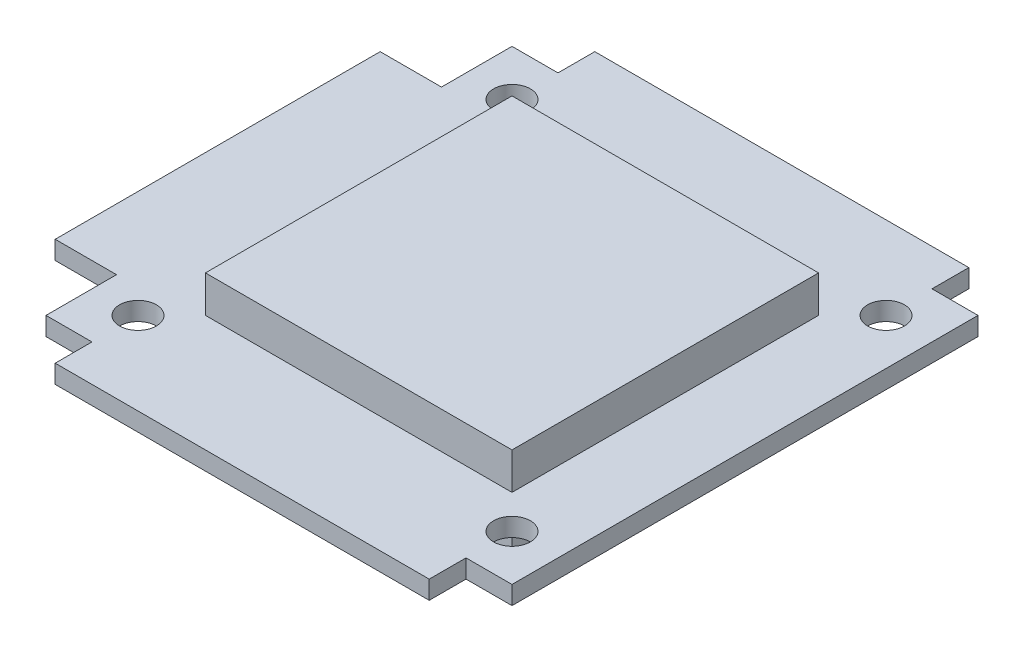
ISO-10303-21;
HEADER;
FILE_DESCRIPTION(('STEP AP214'),'2;1');
FILE_NAME('part.step','',(''),(''),'','','');
FILE_SCHEMA(('AUTOMOTIVE_DESIGN { 1 0 10303 214 1 1 1 1 }'));
ENDSEC;
DATA;
#1=APPLICATION_CONTEXT('core data for automotive mechanical design processes');
#2=APPLICATION_PROTOCOL_DEFINITION('international standard','automotive_design',2000,#1);
#3=PRODUCT_CONTEXT('',#1,'mechanical');
#4=PRODUCT('Part','Part','',(#3));
#5=PRODUCT_RELATED_PRODUCT_CATEGORY('part','',(#4));
#6=PRODUCT_DEFINITION_FORMATION('','',#4);
#7=PRODUCT_DEFINITION_CONTEXT('part definition',#1,'design');
#8=PRODUCT_DEFINITION('design','',#6,#7);
#9=PRODUCT_DEFINITION_SHAPE('','',#8);
#10=(LENGTH_UNIT() NAMED_UNIT(*) SI_UNIT(.MILLI.,.METRE.));
#11=(NAMED_UNIT(*) PLANE_ANGLE_UNIT() SI_UNIT($,.RADIAN.));
#12=(NAMED_UNIT(*) SI_UNIT($,.STERADIAN.) SOLID_ANGLE_UNIT());
#13=UNCERTAINTY_MEASURE_WITH_UNIT(LENGTH_MEASURE(1.E-05),#10,'distance_accuracy_value','');
#14=(GEOMETRIC_REPRESENTATION_CONTEXT(3) GLOBAL_UNCERTAINTY_ASSIGNED_CONTEXT((#13)) GLOBAL_UNIT_ASSIGNED_CONTEXT((#10,
#11,#12)) REPRESENTATION_CONTEXT('',''));
#15=CARTESIAN_POINT('',(0.,0.,0.));
#16=DIRECTION('',(0.,0.,1.));
#17=DIRECTION('',(1.,0.,0.));
#18=AXIS2_PLACEMENT_3D('',#15,#16,#17);
#19=CARTESIAN_POINT('',(-19.,1.5,19.));
#20=DIRECTION('',(0.,0.,-1.));
#21=DIRECTION('',(-1.,0.,0.));
#22=AXIS2_PLACEMENT_3D('',#19,#20,#21);
#23=PLANE('',#22);
#24=DIRECTION('',(0.,-1.,0.));
#25=VECTOR('',#24,1.);
#26=CARTESIAN_POINT('',(-15.25,1.5,19.));
#27=LINE('',#26,#25);
#28=CARTESIAN_POINT('',(-15.25,1.5,19.));
#29=VERTEX_POINT('',#28);
#30=CARTESIAN_POINT('',(-15.25,0.,19.));
#31=VERTEX_POINT('',#30);
#32=EDGE_CURVE('E266',#29,#31,#27,.T.);
#33=ORIENTED_EDGE('',*,*,#32,.F.);
#34=DIRECTION('',(1.,0.,0.));
#35=VECTOR('',#34,1.);
#36=CARTESIAN_POINT('',(-19.,1.5,19.));
#37=LINE('',#36,#35);
#38=CARTESIAN_POINT('',(-19.,1.5,19.));
#39=VERTEX_POINT('',#38);
#40=EDGE_CURVE('E372',#39,#29,#37,.T.);
#41=ORIENTED_EDGE('',*,*,#40,.F.);
#42=DIRECTION('',(0.,-1.,0.));
#43=VECTOR('',#42,1.);
#44=CARTESIAN_POINT('',(-19.,1.5,19.));
#45=LINE('',#44,#43);
#46=CARTESIAN_POINT('',(-19.,0.,19.));
#47=VERTEX_POINT('',#46);
#48=EDGE_CURVE('E391',#39,#47,#45,.T.);
#49=ORIENTED_EDGE('',*,*,#48,.T.);
#50=DIRECTION('',(1.,0.,0.));
#51=VECTOR('',#50,1.);
#52=CARTESIAN_POINT('',(-19.,0.,19.));
#53=LINE('',#52,#51);
#54=EDGE_CURVE('E363',#47,#31,#53,.T.);
#55=ORIENTED_EDGE('',*,*,#54,.T.);
#56=EDGE_LOOP('',(#33,#41,#49,#55));
#57=FACE_BOUND('',#56,.T.);
#58=ADVANCED_FACE('F38',(#57),#23,.F.);
#59=CARTESIAN_POINT('',(-19.,1.5,-19.));
#60=DIRECTION('',(0.,0.,1.));
#61=DIRECTION('',(1.,0.,0.));
#62=AXIS2_PLACEMENT_3D('',#59,#60,#61);
#63=PLANE('',#62);
#64=DIRECTION('',(0.,-1.,0.));
#65=VECTOR('',#64,1.);
#66=CARTESIAN_POINT('',(15.25,1.5,-19.));
#67=LINE('',#66,#65);
#68=CARTESIAN_POINT('',(15.25,1.5,-19.));
#69=VERTEX_POINT('',#68);
#70=CARTESIAN_POINT('',(15.25,0.,-19.));
#71=VERTEX_POINT('',#70);
#72=EDGE_CURVE('E304',#69,#71,#67,.T.);
#73=ORIENTED_EDGE('',*,*,#72,.F.);
#74=DIRECTION('',(-1.,0.,0.));
#75=VECTOR('',#74,1.);
#76=CARTESIAN_POINT('',(-19.,1.5,-19.));
#77=LINE('',#76,#75);
#78=CARTESIAN_POINT('',(19.,1.5,-19.));
#79=VERTEX_POINT('',#78);
#80=EDGE_CURVE('E364',#79,#69,#77,.T.);
#81=ORIENTED_EDGE('',*,*,#80,.F.);
#82=DIRECTION('',(0.,-1.,0.));
#83=VECTOR('',#82,1.);
#84=CARTESIAN_POINT('',(19.,1.5,-19.));
#85=LINE('',#84,#83);
#86=CARTESIAN_POINT('',(19.,0.,-19.));
#87=VERTEX_POINT('',#86);
#88=EDGE_CURVE('E397',#79,#87,#85,.T.);
#89=ORIENTED_EDGE('',*,*,#88,.T.);
#90=DIRECTION('',(-1.,0.,0.));
#91=VECTOR('',#90,1.);
#92=CARTESIAN_POINT('',(-19.,0.,-19.));
#93=LINE('',#92,#91);
#94=EDGE_CURVE('E379',#87,#71,#93,.T.);
#95=ORIENTED_EDGE('',*,*,#94,.T.);
#96=EDGE_LOOP('',(#73,#81,#89,#95));
#97=FACE_BOUND('',#96,.T.);
#98=ADVANCED_FACE('F434',(#97),#63,.F.);
#99=CARTESIAN_POINT('',(-19.,1.5,19.));
#100=DIRECTION('',(1.,0.,0.));
#101=DIRECTION('',(0.,0.,-1.));
#102=AXIS2_PLACEMENT_3D('',#99,#100,#101);
#103=PLANE('',#102);
#104=DIRECTION('',(0.,-1.,0.));
#105=VECTOR('',#104,1.);
#106=CARTESIAN_POINT('',(-19.,1.5,-13.25));
#107=LINE('',#106,#105);
#108=CARTESIAN_POINT('',(-19.,1.5,-13.25));
#109=VERTEX_POINT('',#108);
#110=CARTESIAN_POINT('',(-19.,0.,-13.25));
#111=VERTEX_POINT('',#110);
#112=EDGE_CURVE('E326',#109,#111,#107,.T.);
#113=ORIENTED_EDGE('',*,*,#112,.F.);
#114=DIRECTION('',(0.,0.,1.));
#115=VECTOR('',#114,1.);
#116=CARTESIAN_POINT('',(-19.,1.5,19.));
#117=LINE('',#116,#115);
#118=CARTESIAN_POINT('',(-19.,1.5,-19.));
#119=VERTEX_POINT('',#118);
#120=EDGE_CURVE('E368',#119,#109,#117,.T.);
#121=ORIENTED_EDGE('',*,*,#120,.F.);
#122=DIRECTION('',(0.,-1.,0.));
#123=VECTOR('',#122,1.);
#124=CARTESIAN_POINT('',(-19.,1.5,-19.));
#125=LINE('',#124,#123);
#126=CARTESIAN_POINT('',(-19.,0.,-19.));
#127=VERTEX_POINT('',#126);
#128=EDGE_CURVE('E394',#119,#127,#125,.T.);
#129=ORIENTED_EDGE('',*,*,#128,.T.);
#130=DIRECTION('',(0.,0.,1.));
#131=VECTOR('',#130,1.);
#132=CARTESIAN_POINT('',(-19.,0.,19.));
#133=LINE('',#132,#131);
#134=EDGE_CURVE('E383',#127,#111,#133,.T.);
#135=ORIENTED_EDGE('',*,*,#134,.T.);
#136=EDGE_LOOP('',(#113,#121,#129,#135));
#137=FACE_BOUND('',#136,.T.);
#138=ADVANCED_FACE('F442',(#137),#103,.F.);
#139=CARTESIAN_POINT('',(0.,1.5,0.));
#140=DIRECTION('',(0.,-1.,0.));
#141=DIRECTION('',(0.,0.,-1.));
#142=AXIS2_PLACEMENT_3D('',#139,#140,#141);
#143=PLANE('',#142);
#144=DIRECTION('',(1.,0.,0.));
#145=VECTOR('',#144,1.);
#146=CARTESIAN_POINT('',(0.,1.5,-12.5));
#147=LINE('',#146,#145);
#148=CARTESIAN_POINT('',(-12.5,1.5,-12.5));
#149=VERTEX_POINT('',#148);
#150=CARTESIAN_POINT('',(12.5,1.5,-12.5));
#151=VERTEX_POINT('',#150);
#152=EDGE_CURVE('E238',#149,#151,#147,.T.);
#153=ORIENTED_EDGE('',*,*,#152,.T.);
#154=DIRECTION('',(0.,0.,1.));
#155=VECTOR('',#154,1.);
#156=CARTESIAN_POINT('',(12.5,1.5,0.));
#157=LINE('',#156,#155);
#158=CARTESIAN_POINT('',(12.5,1.5,12.5));
#159=VERTEX_POINT('',#158);
#160=EDGE_CURVE('E201',#151,#159,#157,.T.);
#161=ORIENTED_EDGE('',*,*,#160,.T.);
#162=DIRECTION('',(-1.,0.,0.));
#163=VECTOR('',#162,1.);
#164=CARTESIAN_POINT('',(0.,1.5,12.5));
#165=LINE('',#164,#163);
#166=CARTESIAN_POINT('',(-12.5,1.5,12.5));
#167=VERTEX_POINT('',#166);
#168=EDGE_CURVE('E252',#159,#167,#165,.T.);
#169=ORIENTED_EDGE('',*,*,#168,.T.);
#170=DIRECTION('',(0.,0.,-1.));
#171=VECTOR('',#170,1.);
#172=CARTESIAN_POINT('',(-12.5,1.5,0.));
#173=LINE('',#172,#171);
#174=EDGE_CURVE('E249',#167,#149,#173,.T.);
#175=ORIENTED_EDGE('',*,*,#174,.T.);
#176=EDGE_LOOP('',(#153,#161,#169,#175));
#177=FACE_BOUND('',#176,.T.);
#178=DIRECTION('',(0.,0.,-1.));
#179=VECTOR('',#178,1.);
#180=CARTESIAN_POINT('',(19.,1.5,19.));
#181=LINE('',#180,#179);
#182=CARTESIAN_POINT('',(19.,1.5,19.));
#183=VERTEX_POINT('',#182);
#184=EDGE_CURVE('E359',#183,#79,#181,.T.);
#185=ORIENTED_EDGE('',*,*,#184,.T.);
#186=ORIENTED_EDGE('',*,*,#80,.T.);
#187=DIRECTION('',(0.,0.,1.));
#188=VECTOR('',#187,1.);
#189=CARTESIAN_POINT('',(15.25,1.5,-19.));
#190=LINE('',#189,#188);
#191=CARTESIAN_POINT('',(15.25,1.5,-22.));
#192=VERTEX_POINT('',#191);
#193=EDGE_CURVE('E290',#192,#69,#190,.T.);
#194=ORIENTED_EDGE('',*,*,#193,.F.);
#195=DIRECTION('',(1.,0.,0.));
#196=VECTOR('',#195,1.);
#197=CARTESIAN_POINT('',(-15.25,1.5,-22.));
#198=LINE('',#197,#196);
#199=CARTESIAN_POINT('',(-15.25,1.5,-22.));
#200=VERTEX_POINT('',#199);
#201=EDGE_CURVE('E286',#200,#192,#198,.T.);
#202=ORIENTED_EDGE('',*,*,#201,.F.);
#203=DIRECTION('',(0.,0.,-1.));
#204=VECTOR('',#203,1.);
#205=CARTESIAN_POINT('',(-15.25,1.5,-19.));
#206=LINE('',#205,#204);
#207=CARTESIAN_POINT('',(-15.25,1.5,-19.));
#208=VERTEX_POINT('',#207);
#209=EDGE_CURVE('E283',#208,#200,#206,.T.);
#210=ORIENTED_EDGE('',*,*,#209,.F.);
#211=EDGE_CURVE('E362',#208,#119,#77,.T.);
#212=ORIENTED_EDGE('',*,*,#211,.T.);
#213=ORIENTED_EDGE('',*,*,#120,.T.);
#214=DIRECTION('',(1.,0.,0.));
#215=VECTOR('',#214,1.);
#216=CARTESIAN_POINT('',(-19.,1.5,-13.25));
#217=LINE('',#216,#215);
#218=CARTESIAN_POINT('',(-24.,1.5,-13.25));
#219=VERTEX_POINT('',#218);
#220=EDGE_CURVE('E316',#219,#109,#217,.T.);
#221=ORIENTED_EDGE('',*,*,#220,.F.);
#222=DIRECTION('',(0.,0.,-1.));
#223=VECTOR('',#222,1.);
#224=CARTESIAN_POINT('',(-24.,1.5,13.25));
#225=LINE('',#224,#223);
#226=CARTESIAN_POINT('',(-24.,1.5,13.25));
#227=VERTEX_POINT('',#226);
#228=EDGE_CURVE('E312',#227,#219,#225,.T.);
#229=ORIENTED_EDGE('',*,*,#228,.F.);
#230=DIRECTION('',(-1.,0.,0.));
#231=VECTOR('',#230,1.);
#232=CARTESIAN_POINT('',(-19.,1.5,13.25));
#233=LINE('',#232,#231);
#234=CARTESIAN_POINT('',(-19.,1.5,13.25));
#235=VERTEX_POINT('',#234);
#236=EDGE_CURVE('E309',#235,#227,#233,.T.);
#237=ORIENTED_EDGE('',*,*,#236,.F.);
#238=EDGE_CURVE('E367',#235,#39,#117,.T.);
#239=ORIENTED_EDGE('',*,*,#238,.T.);
#240=ORIENTED_EDGE('',*,*,#40,.T.);
#241=DIRECTION('',(0.,0.,-1.));
#242=VECTOR('',#241,1.);
#243=CARTESIAN_POINT('',(-15.25,1.5,19.));
#244=LINE('',#243,#242);
#245=CARTESIAN_POINT('',(-15.25,1.5,22.));
#246=VERTEX_POINT('',#245);
#247=EDGE_CURVE('E257',#246,#29,#244,.T.);
#248=ORIENTED_EDGE('',*,*,#247,.F.);
#249=DIRECTION('',(-1.,0.,0.));
#250=VECTOR('',#249,1.);
#251=CARTESIAN_POINT('',(-15.25,1.5,22.));
#252=LINE('',#251,#250);
#253=CARTESIAN_POINT('',(15.25,1.5,22.));
#254=VERTEX_POINT('',#253);
#255=EDGE_CURVE('E263',#254,#246,#252,.T.);
#256=ORIENTED_EDGE('',*,*,#255,.F.);
#257=DIRECTION('',(0.,0.,1.));
#258=VECTOR('',#257,1.);
#259=CARTESIAN_POINT('',(15.25,1.5,19.));
#260=LINE('',#259,#258);
#261=CARTESIAN_POINT('',(15.25,1.5,19.));
#262=VERTEX_POINT('',#261);
#263=EDGE_CURVE('E259',#262,#254,#260,.T.);
#264=ORIENTED_EDGE('',*,*,#263,.F.);
#265=EDGE_CURVE('E371',#262,#183,#37,.T.);
#266=ORIENTED_EDGE('',*,*,#265,.T.);
#267=EDGE_LOOP('',(#185,#186,#194,#202,#210,#212,#213,#221,#229,#237,#239,#240,#248,#256,#264,#266));
#268=FACE_BOUND('',#267,.T.);
#269=CARTESIAN_POINT('',(-15.25,1.5,-15.25));
#270=DIRECTION('',(0.,1.,0.));
#271=DIRECTION('',(0.,0.,1.));
#272=AXIS2_PLACEMENT_3D('',#269,#270,#271);
#273=CIRCLE('',#272,1.5);
#274=CARTESIAN_POINT('',(-15.25,1.5,-13.75));
#275=VERTEX_POINT('',#274);
#276=EDGE_CURVE('E353',#275,#275,#273,.T.);
#277=ORIENTED_EDGE('',*,*,#276,.F.);
#278=EDGE_LOOP('',(#277));
#279=FACE_BOUND('',#278,.T.);
#280=CARTESIAN_POINT('',(15.25,1.5,-15.2500000000009));
#281=DIRECTION('',(0.,1.,0.));
#282=DIRECTION('',(0.,0.,1.));
#283=AXIS2_PLACEMENT_3D('',#280,#281,#282);
#284=CIRCLE('',#283,1.50000000000089);
#285=CARTESIAN_POINT('',(15.25,1.5,-13.75));
#286=VERTEX_POINT('',#285);
#287=EDGE_CURVE('E347',#286,#286,#284,.T.);
#288=ORIENTED_EDGE('',*,*,#287,.F.);
#289=EDGE_LOOP('',(#288));
#290=FACE_BOUND('',#289,.T.);
#291=CARTESIAN_POINT('',(15.2500000000009,1.5,15.2499999999991));
#292=DIRECTION('',(0.,1.,0.));
#293=DIRECTION('',(0.,0.,1.));
#294=AXIS2_PLACEMENT_3D('',#291,#292,#293);
#295=CIRCLE('',#294,1.50000000000121);
#296=CARTESIAN_POINT('',(15.2500000000009,1.5,16.7500000000004));
#297=VERTEX_POINT('',#296);
#298=EDGE_CURVE('E341',#297,#297,#295,.T.);
#299=ORIENTED_EDGE('',*,*,#298,.F.);
#300=EDGE_LOOP('',(#299));
#301=FACE_BOUND('',#300,.T.);
#302=CARTESIAN_POINT('',(-15.2499999999991,1.5,15.25));
#303=DIRECTION('',(0.,1.,0.));
#304=DIRECTION('',(0.,0.,1.));
#305=AXIS2_PLACEMENT_3D('',#302,#303,#304);
#306=CIRCLE('',#305,1.50000000000046);
#307=CARTESIAN_POINT('',(-15.2499999999991,1.5,16.7500000000005));
#308=VERTEX_POINT('',#307);
#309=EDGE_CURVE('E335',#308,#308,#306,.T.);
#310=ORIENTED_EDGE('',*,*,#309,.F.);
#311=EDGE_LOOP('',(#310));
#312=FACE_BOUND('',#311,.T.);
#313=ADVANCED_FACE('F467',(#177,#268,#279,#290,#301,#312),#143,.F.);
#314=CARTESIAN_POINT('',(0.,0.,0.));
#315=DIRECTION('',(0.,-1.,0.));
#316=DIRECTION('',(0.,0.,-1.));
#317=AXIS2_PLACEMENT_3D('',#314,#315,#316);
#318=PLANE('',#317);
#319=DIRECTION('',(0.,0.,1.));
#320=VECTOR('',#319,1.);
#321=CARTESIAN_POINT('',(12.5,0.,0.));
#322=LINE('',#321,#320);
#323=CARTESIAN_POINT('',(12.5,0.,-12.5));
#324=VERTEX_POINT('',#323);
#325=CARTESIAN_POINT('',(12.5,0.,12.5));
#326=VERTEX_POINT('',#325);
#327=EDGE_CURVE('E11',#324,#326,#322,.T.);
#328=ORIENTED_EDGE('',*,*,#327,.F.);
#329=DIRECTION('',(1.,0.,0.));
#330=VECTOR('',#329,1.);
#331=CARTESIAN_POINT('',(0.,0.,-12.5));
#332=LINE('',#331,#330);
#333=CARTESIAN_POINT('',(-12.5,0.,-12.5));
#334=VERTEX_POINT('',#333);
#335=EDGE_CURVE('E400',#334,#324,#332,.T.);
#336=ORIENTED_EDGE('',*,*,#335,.F.);
#337=DIRECTION('',(0.,0.,-1.));
#338=VECTOR('',#337,1.);
#339=CARTESIAN_POINT('',(-12.5,0.,0.));
#340=LINE('',#339,#338);
#341=CARTESIAN_POINT('',(-12.5,0.,12.5));
#342=VERTEX_POINT('',#341);
#343=EDGE_CURVE('E403',#342,#334,#340,.T.);
#344=ORIENTED_EDGE('',*,*,#343,.F.);
#345=DIRECTION('',(-1.,0.,0.));
#346=VECTOR('',#345,1.);
#347=CARTESIAN_POINT('',(0.,0.,12.5));
#348=LINE('',#347,#346);
#349=EDGE_CURVE('E46',#326,#342,#348,.T.);
#350=ORIENTED_EDGE('',*,*,#349,.F.);
#351=EDGE_LOOP('',(#328,#336,#344,#350));
#352=FACE_BOUND('',#351,.T.);
#353=CARTESIAN_POINT('',(15.2500000000009,0.,15.2499999999991));
#354=DIRECTION('',(0.,1.,0.));
#355=DIRECTION('',(0.,0.,1.));
#356=AXIS2_PLACEMENT_3D('',#353,#354,#355);
#357=CIRCLE('',#356,1.50000000000121);
#358=CARTESIAN_POINT('',(15.2500000000009,0.,16.7500000000004));
#359=VERTEX_POINT('',#358);
#360=EDGE_CURVE('E338',#359,#359,#357,.T.);
#361=ORIENTED_EDGE('',*,*,#360,.T.);
#362=EDGE_LOOP('',(#361));
#363=FACE_BOUND('',#362,.T.);
#364=CARTESIAN_POINT('',(-15.25,0.,-15.25));
#365=DIRECTION('',(0.,1.,0.));
#366=DIRECTION('',(0.,0.,1.));
#367=AXIS2_PLACEMENT_3D('',#364,#365,#366);
#368=CIRCLE('',#367,1.5);
#369=CARTESIAN_POINT('',(-15.25,0.,-13.75));
#370=VERTEX_POINT('',#369);
#371=EDGE_CURVE('E350',#370,#370,#368,.T.);
#372=ORIENTED_EDGE('',*,*,#371,.T.);
#373=EDGE_LOOP('',(#372));
#374=FACE_BOUND('',#373,.T.);
#375=DIRECTION('',(0.,0.,-1.));
#376=VECTOR('',#375,1.);
#377=CARTESIAN_POINT('',(19.,0.,19.));
#378=LINE('',#377,#376);
#379=CARTESIAN_POINT('',(19.,0.,19.));
#380=VERTEX_POINT('',#379);
#381=EDGE_CURVE('E356',#380,#87,#378,.T.);
#382=ORIENTED_EDGE('',*,*,#381,.F.);
#383=CARTESIAN_POINT('',(15.25,0.,19.));
#384=VERTEX_POINT('',#383);
#385=EDGE_CURVE('E386',#384,#380,#53,.T.);
#386=ORIENTED_EDGE('',*,*,#385,.F.);
#387=DIRECTION('',(0.,0.,1.));
#388=VECTOR('',#387,1.);
#389=CARTESIAN_POINT('',(15.25,0.,19.));
#390=LINE('',#389,#388);
#391=CARTESIAN_POINT('',(15.25,0.,22.));
#392=VERTEX_POINT('',#391);
#393=EDGE_CURVE('E269',#384,#392,#390,.T.);
#394=ORIENTED_EDGE('',*,*,#393,.T.);
#395=DIRECTION('',(-1.,0.,0.));
#396=VECTOR('',#395,1.);
#397=CARTESIAN_POINT('',(-15.25,0.,22.));
#398=LINE('',#397,#396);
#399=CARTESIAN_POINT('',(-15.25,0.,22.));
#400=VERTEX_POINT('',#399);
#401=EDGE_CURVE('E260',#392,#400,#398,.T.);
#402=ORIENTED_EDGE('',*,*,#401,.T.);
#403=DIRECTION('',(0.,0.,-1.));
#404=VECTOR('',#403,1.);
#405=CARTESIAN_POINT('',(-15.25,0.,19.));
#406=LINE('',#405,#404);
#407=EDGE_CURVE('E256',#400,#31,#406,.T.);
#408=ORIENTED_EDGE('',*,*,#407,.T.);
#409=ORIENTED_EDGE('',*,*,#54,.F.);
#410=CARTESIAN_POINT('',(-19.,0.,13.25));
#411=VERTEX_POINT('',#410);
#412=EDGE_CURVE('E382',#411,#47,#133,.T.);
#413=ORIENTED_EDGE('',*,*,#412,.F.);
#414=DIRECTION('',(-1.,0.,0.));
#415=VECTOR('',#414,1.);
#416=CARTESIAN_POINT('',(-19.,0.,13.25));
#417=LINE('',#416,#415);
#418=CARTESIAN_POINT('',(-24.,0.,13.25));
#419=VERTEX_POINT('',#418);
#420=EDGE_CURVE('E303',#411,#419,#417,.T.);
#421=ORIENTED_EDGE('',*,*,#420,.T.);
#422=DIRECTION('',(0.,0.,-1.));
#423=VECTOR('',#422,1.);
#424=CARTESIAN_POINT('',(-24.,0.,13.25));
#425=LINE('',#424,#423);
#426=CARTESIAN_POINT('',(-24.,0.,-13.25));
#427=VERTEX_POINT('',#426);
#428=EDGE_CURVE('E321',#419,#427,#425,.T.);
#429=ORIENTED_EDGE('',*,*,#428,.T.);
#430=DIRECTION('',(1.,0.,0.));
#431=VECTOR('',#430,1.);
#432=CARTESIAN_POINT('',(-19.,0.,-13.25));
#433=LINE('',#432,#431);
#434=EDGE_CURVE('E313',#427,#111,#433,.T.);
#435=ORIENTED_EDGE('',*,*,#434,.T.);
#436=ORIENTED_EDGE('',*,*,#134,.F.);
#437=CARTESIAN_POINT('',(-15.25,0.,-19.));
#438=VERTEX_POINT('',#437);
#439=EDGE_CURVE('E378',#438,#127,#93,.T.);
#440=ORIENTED_EDGE('',*,*,#439,.F.);
#441=DIRECTION('',(0.,0.,-1.));
#442=VECTOR('',#441,1.);
#443=CARTESIAN_POINT('',(-15.25,0.,-19.));
#444=LINE('',#443,#442);
#445=CARTESIAN_POINT('',(-15.25,0.,-22.));
#446=VERTEX_POINT('',#445);
#447=EDGE_CURVE('E276',#438,#446,#444,.T.);
#448=ORIENTED_EDGE('',*,*,#447,.T.);
#449=DIRECTION('',(1.,0.,0.));
#450=VECTOR('',#449,1.);
#451=CARTESIAN_POINT('',(-15.25,0.,-22.));
#452=LINE('',#451,#450);
#453=CARTESIAN_POINT('',(15.25,0.,-22.));
#454=VERTEX_POINT('',#453);
#455=EDGE_CURVE('E295',#446,#454,#452,.T.);
#456=ORIENTED_EDGE('',*,*,#455,.T.);
#457=DIRECTION('',(0.,0.,1.));
#458=VECTOR('',#457,1.);
#459=CARTESIAN_POINT('',(15.25,0.,-19.));
#460=LINE('',#459,#458);
#461=EDGE_CURVE('E287',#454,#71,#460,.T.);
#462=ORIENTED_EDGE('',*,*,#461,.T.);
#463=ORIENTED_EDGE('',*,*,#94,.F.);
#464=EDGE_LOOP('',(#382,#386,#394,#402,#408,#409,#413,#421,#429,#435,#436,#440,#448,#456,#462,#463));
#465=FACE_BOUND('',#464,.T.);
#466=CARTESIAN_POINT('',(15.25,0.,-15.2500000000009));
#467=DIRECTION('',(0.,1.,0.));
#468=DIRECTION('',(0.,0.,1.));
#469=AXIS2_PLACEMENT_3D('',#466,#467,#468);
#470=CIRCLE('',#469,1.50000000000089);
#471=CARTESIAN_POINT('',(15.25,0.,-13.75));
#472=VERTEX_POINT('',#471);
#473=EDGE_CURVE('E344',#472,#472,#470,.T.);
#474=ORIENTED_EDGE('',*,*,#473,.T.);
#475=EDGE_LOOP('',(#474));
#476=FACE_BOUND('',#475,.T.);
#477=CARTESIAN_POINT('',(-15.2499999999991,0.,15.25));
#478=DIRECTION('',(0.,1.,0.));
#479=DIRECTION('',(0.,0.,1.));
#480=AXIS2_PLACEMENT_3D('',#477,#478,#479);
#481=CIRCLE('',#480,1.50000000000046);
#482=CARTESIAN_POINT('',(-15.2499999999991,0.,16.7500000000005));
#483=VERTEX_POINT('',#482);
#484=EDGE_CURVE('E328',#483,#483,#481,.T.);
#485=ORIENTED_EDGE('',*,*,#484,.T.);
#486=EDGE_LOOP('',(#485));
#487=FACE_BOUND('',#486,.T.);
#488=ADVANCED_FACE('F417',(#352,#363,#374,#465,#476,#487),#318,.T.);
#489=CARTESIAN_POINT('',(19.,1.5,19.));
#490=DIRECTION('',(-1.,0.,0.));
#491=DIRECTION('',(0.,0.,1.));
#492=AXIS2_PLACEMENT_3D('',#489,#490,#491);
#493=PLANE('',#492);
#494=ORIENTED_EDGE('',*,*,#381,.T.);
#495=ORIENTED_EDGE('',*,*,#88,.F.);
#496=ORIENTED_EDGE('',*,*,#184,.F.);
#497=DIRECTION('',(0.,-1.,0.));
#498=VECTOR('',#497,1.);
#499=CARTESIAN_POINT('',(19.,1.5,19.));
#500=LINE('',#499,#498);
#501=EDGE_CURVE('E375',#183,#380,#500,.T.);
#502=ORIENTED_EDGE('',*,*,#501,.T.);
#503=EDGE_LOOP('',(#494,#495,#496,#502));
#504=FACE_BOUND('',#503,.T.);
#505=ADVANCED_FACE('F40',(#504),#493,.F.);
#506=ORIENTED_EDGE('',*,*,#211,.F.);
#507=DIRECTION('',(0.,-1.,0.));
#508=VECTOR('',#507,1.);
#509=CARTESIAN_POINT('',(-15.25,1.5,-19.));
#510=LINE('',#509,#508);
#511=EDGE_CURVE('E300',#208,#438,#510,.T.);
#512=ORIENTED_EDGE('',*,*,#511,.T.);
#513=ORIENTED_EDGE('',*,*,#439,.T.);
#514=ORIENTED_EDGE('',*,*,#128,.F.);
#515=EDGE_LOOP('',(#506,#512,#513,#514));
#516=FACE_BOUND('',#515,.T.);
#517=ADVANCED_FACE('F444',(#516),#63,.F.);
#518=ORIENTED_EDGE('',*,*,#238,.F.);
#519=DIRECTION('',(0.,-1.,0.));
#520=VECTOR('',#519,1.);
#521=CARTESIAN_POINT('',(-19.,1.5,13.25));
#522=LINE('',#521,#520);
#523=EDGE_CURVE('E318',#235,#411,#522,.T.);
#524=ORIENTED_EDGE('',*,*,#523,.T.);
#525=ORIENTED_EDGE('',*,*,#412,.T.);
#526=ORIENTED_EDGE('',*,*,#48,.F.);
#527=EDGE_LOOP('',(#518,#524,#525,#526));
#528=FACE_BOUND('',#527,.T.);
#529=ADVANCED_FACE('F450',(#528),#103,.F.);
#530=ORIENTED_EDGE('',*,*,#265,.F.);
#531=DIRECTION('',(0.,-1.,0.));
#532=VECTOR('',#531,1.);
#533=CARTESIAN_POINT('',(15.25,1.5,19.));
#534=LINE('',#533,#532);
#535=EDGE_CURVE('E279',#262,#384,#534,.T.);
#536=ORIENTED_EDGE('',*,*,#535,.T.);
#537=ORIENTED_EDGE('',*,*,#385,.T.);
#538=ORIENTED_EDGE('',*,*,#501,.F.);
#539=EDGE_LOOP('',(#530,#536,#537,#538));
#540=FACE_BOUND('',#539,.T.);
#541=ADVANCED_FACE('F437',(#540),#23,.F.);
#542=CARTESIAN_POINT('',(-15.25,1.5,-15.25));
#543=DIRECTION('',(0.,-1.,0.));
#544=DIRECTION('',(0.,0.,-1.));
#545=AXIS2_PLACEMENT_3D('',#542,#543,#544);
#546=CYLINDRICAL_SURFACE('',#545,1.5);
#547=ORIENTED_EDGE('',*,*,#276,.T.);
#548=EDGE_LOOP('',(#547));
#549=FACE_BOUND('',#548,.T.);
#550=ORIENTED_EDGE('',*,*,#371,.F.);
#551=EDGE_LOOP('',(#550));
#552=FACE_BOUND('',#551,.T.);
#553=ADVANCED_FACE('F449',(#549,#552),#546,.F.);
#554=CARTESIAN_POINT('',(15.25,1.5,-15.2500000000009));
#555=DIRECTION('',(0.,-1.,0.));
#556=DIRECTION('',(0.,0.,-1.));
#557=AXIS2_PLACEMENT_3D('',#554,#555,#556);
#558=CYLINDRICAL_SURFACE('',#557,1.50000000000089);
#559=ORIENTED_EDGE('',*,*,#287,.T.);
#560=EDGE_LOOP('',(#559));
#561=FACE_BOUND('',#560,.T.);
#562=ORIENTED_EDGE('',*,*,#473,.F.);
#563=EDGE_LOOP('',(#562));
#564=FACE_BOUND('',#563,.T.);
#565=ADVANCED_FACE('F457',(#561,#564),#558,.F.);
#566=CARTESIAN_POINT('',(15.2500000000009,1.5,15.2499999999991));
#567=DIRECTION('',(0.,-1.,0.));
#568=DIRECTION('',(0.,0.,-1.));
#569=AXIS2_PLACEMENT_3D('',#566,#567,#568);
#570=CYLINDRICAL_SURFACE('',#569,1.50000000000121);
#571=ORIENTED_EDGE('',*,*,#298,.T.);
#572=EDGE_LOOP('',(#571));
#573=FACE_BOUND('',#572,.T.);
#574=ORIENTED_EDGE('',*,*,#360,.F.);
#575=EDGE_LOOP('',(#574));
#576=FACE_BOUND('',#575,.T.);
#577=ADVANCED_FACE('F534',(#573,#576),#570,.F.);
#578=CARTESIAN_POINT('',(-15.2499999999991,1.5,15.25));
#579=DIRECTION('',(0.,-1.,0.));
#580=DIRECTION('',(0.,0.,-1.));
#581=AXIS2_PLACEMENT_3D('',#578,#579,#580);
#582=CYLINDRICAL_SURFACE('',#581,1.50000000000046);
#583=ORIENTED_EDGE('',*,*,#309,.T.);
#584=EDGE_LOOP('',(#583));
#585=FACE_BOUND('',#584,.T.);
#586=ORIENTED_EDGE('',*,*,#484,.F.);
#587=EDGE_LOOP('',(#586));
#588=FACE_BOUND('',#587,.T.);
#589=ADVANCED_FACE('F538',(#585,#588),#582,.F.);
#590=CARTESIAN_POINT('',(-19.,1.5,-13.25));
#591=DIRECTION('',(0.,0.,-1.));
#592=DIRECTION('',(-1.,0.,0.));
#593=AXIS2_PLACEMENT_3D('',#590,#591,#592);
#594=PLANE('',#593);
#595=ORIENTED_EDGE('',*,*,#434,.F.);
#596=DIRECTION('',(0.,-1.,0.));
#597=VECTOR('',#596,1.);
#598=CARTESIAN_POINT('',(-24.,1.5,-13.25));
#599=LINE('',#598,#597);
#600=EDGE_CURVE('E329',#219,#427,#599,.T.);
#601=ORIENTED_EDGE('',*,*,#600,.F.);
#602=ORIENTED_EDGE('',*,*,#220,.T.);
#603=ORIENTED_EDGE('',*,*,#112,.T.);
#604=EDGE_LOOP('',(#595,#601,#602,#603));
#605=FACE_BOUND('',#604,.T.);
#606=ADVANCED_FACE('F497',(#605),#594,.T.);
#607=CARTESIAN_POINT('',(-24.,1.5,13.25));
#608=DIRECTION('',(-1.,0.,0.));
#609=DIRECTION('',(0.,0.,1.));
#610=AXIS2_PLACEMENT_3D('',#607,#608,#609);
#611=PLANE('',#610);
#612=ORIENTED_EDGE('',*,*,#428,.F.);
#613=DIRECTION('',(0.,-1.,0.));
#614=VECTOR('',#613,1.);
#615=CARTESIAN_POINT('',(-24.,1.5,13.25));
#616=LINE('',#615,#614);
#617=EDGE_CURVE('E331',#227,#419,#616,.T.);
#618=ORIENTED_EDGE('',*,*,#617,.F.);
#619=ORIENTED_EDGE('',*,*,#228,.T.);
#620=ORIENTED_EDGE('',*,*,#600,.T.);
#621=EDGE_LOOP('',(#612,#618,#619,#620));
#622=FACE_BOUND('',#621,.T.);
#623=ADVANCED_FACE('F494',(#622),#611,.T.);
#624=CARTESIAN_POINT('',(-19.,1.5,13.25));
#625=DIRECTION('',(0.,0.,1.));
#626=DIRECTION('',(1.,0.,0.));
#627=AXIS2_PLACEMENT_3D('',#624,#625,#626);
#628=PLANE('',#627);
#629=ORIENTED_EDGE('',*,*,#420,.F.);
#630=ORIENTED_EDGE('',*,*,#523,.F.);
#631=ORIENTED_EDGE('',*,*,#236,.T.);
#632=ORIENTED_EDGE('',*,*,#617,.T.);
#633=EDGE_LOOP('',(#629,#630,#631,#632));
#634=FACE_BOUND('',#633,.T.);
#635=ADVANCED_FACE('F490',(#634),#628,.T.);
#636=CARTESIAN_POINT('',(-15.25,1.5,-19.));
#637=DIRECTION('',(-1.,0.,0.));
#638=DIRECTION('',(0.,0.,1.));
#639=AXIS2_PLACEMENT_3D('',#636,#637,#638);
#640=PLANE('',#639);
#641=ORIENTED_EDGE('',*,*,#447,.F.);
#642=ORIENTED_EDGE('',*,*,#511,.F.);
#643=ORIENTED_EDGE('',*,*,#209,.T.);
#644=DIRECTION('',(0.,-1.,0.));
#645=VECTOR('',#644,1.);
#646=CARTESIAN_POINT('',(-15.25,1.5,-22.));
#647=LINE('',#646,#645);
#648=EDGE_CURVE('E292',#200,#446,#647,.T.);
#649=ORIENTED_EDGE('',*,*,#648,.T.);
#650=EDGE_LOOP('',(#641,#642,#643,#649));
#651=FACE_BOUND('',#650,.T.);
#652=ADVANCED_FACE('F508',(#651),#640,.T.);
#653=CARTESIAN_POINT('',(15.25,1.5,-19.));
#654=DIRECTION('',(1.,0.,0.));
#655=DIRECTION('',(0.,0.,-1.));
#656=AXIS2_PLACEMENT_3D('',#653,#654,#655);
#657=PLANE('',#656);
#658=ORIENTED_EDGE('',*,*,#461,.F.);
#659=DIRECTION('',(0.,-1.,0.));
#660=VECTOR('',#659,1.);
#661=CARTESIAN_POINT('',(15.25,1.5,-22.));
#662=LINE('',#661,#660);
#663=EDGE_CURVE('E306',#192,#454,#662,.T.);
#664=ORIENTED_EDGE('',*,*,#663,.F.);
#665=ORIENTED_EDGE('',*,*,#193,.T.);
#666=ORIENTED_EDGE('',*,*,#72,.T.);
#667=EDGE_LOOP('',(#658,#664,#665,#666));
#668=FACE_BOUND('',#667,.T.);
#669=ADVANCED_FACE('F516',(#668),#657,.T.);
#670=CARTESIAN_POINT('',(-15.25,1.5,-22.));
#671=DIRECTION('',(0.,0.,-1.));
#672=DIRECTION('',(-1.,0.,0.));
#673=AXIS2_PLACEMENT_3D('',#670,#671,#672);
#674=PLANE('',#673);
#675=ORIENTED_EDGE('',*,*,#455,.F.);
#676=ORIENTED_EDGE('',*,*,#648,.F.);
#677=ORIENTED_EDGE('',*,*,#201,.T.);
#678=ORIENTED_EDGE('',*,*,#663,.T.);
#679=EDGE_LOOP('',(#675,#676,#677,#678));
#680=FACE_BOUND('',#679,.T.);
#681=ADVANCED_FACE('F512',(#680),#674,.T.);
#682=CARTESIAN_POINT('',(-15.25,1.5,19.));
#683=DIRECTION('',(-1.,0.,0.));
#684=DIRECTION('',(0.,0.,1.));
#685=AXIS2_PLACEMENT_3D('',#682,#683,#684);
#686=PLANE('',#685);
#687=ORIENTED_EDGE('',*,*,#407,.F.);
#688=DIRECTION('',(0.,-1.,0.));
#689=VECTOR('',#688,1.);
#690=CARTESIAN_POINT('',(-15.25,1.5,22.));
#691=LINE('',#690,#689);
#692=EDGE_CURVE('E274',#246,#400,#691,.T.);
#693=ORIENTED_EDGE('',*,*,#692,.F.);
#694=ORIENTED_EDGE('',*,*,#247,.T.);
#695=ORIENTED_EDGE('',*,*,#32,.T.);
#696=EDGE_LOOP('',(#687,#693,#694,#695));
#697=FACE_BOUND('',#696,.T.);
#698=ADVANCED_FACE('F481',(#697),#686,.T.);
#699=CARTESIAN_POINT('',(-15.25,1.5,22.));
#700=DIRECTION('',(0.,0.,1.));
#701=DIRECTION('',(1.,0.,0.));
#702=AXIS2_PLACEMENT_3D('',#699,#700,#701);
#703=PLANE('',#702);
#704=ORIENTED_EDGE('',*,*,#401,.F.);
#705=DIRECTION('',(0.,-1.,0.));
#706=VECTOR('',#705,1.);
#707=CARTESIAN_POINT('',(15.25,1.5,22.));
#708=LINE('',#707,#706);
#709=EDGE_CURVE('E277',#254,#392,#708,.T.);
#710=ORIENTED_EDGE('',*,*,#709,.F.);
#711=ORIENTED_EDGE('',*,*,#255,.T.);
#712=ORIENTED_EDGE('',*,*,#692,.T.);
#713=EDGE_LOOP('',(#704,#710,#711,#712));
#714=FACE_BOUND('',#713,.T.);
#715=ADVANCED_FACE('F478',(#714),#703,.T.);
#716=CARTESIAN_POINT('',(15.25,1.5,19.));
#717=DIRECTION('',(1.,0.,0.));
#718=DIRECTION('',(0.,0.,-1.));
#719=AXIS2_PLACEMENT_3D('',#716,#717,#718);
#720=PLANE('',#719);
#721=ORIENTED_EDGE('',*,*,#393,.F.);
#722=ORIENTED_EDGE('',*,*,#535,.F.);
#723=ORIENTED_EDGE('',*,*,#263,.T.);
#724=ORIENTED_EDGE('',*,*,#709,.T.);
#725=EDGE_LOOP('',(#721,#722,#723,#724));
#726=FACE_BOUND('',#725,.T.);
#727=ADVANCED_FACE('F429',(#726),#720,.T.);
#728=CARTESIAN_POINT('',(0.,-3.,0.));
#729=DIRECTION('',(0.,-1.,0.));
#730=DIRECTION('',(0.,0.,-1.));
#731=AXIS2_PLACEMENT_3D('',#728,#729,#730);
#732=PLANE('',#731);
#733=DIRECTION('',(0.,0.,-1.));
#734=VECTOR('',#733,1.);
#735=CARTESIAN_POINT('',(12.5,-3.,12.5));
#736=LINE('',#735,#734);
#737=CARTESIAN_POINT('',(12.5,-3.,12.5));
#738=VERTEX_POINT('',#737);
#739=CARTESIAN_POINT('',(12.5,-3.,-12.5));
#740=VERTEX_POINT('',#739);
#741=EDGE_CURVE('E224',#738,#740,#736,.T.);
#742=ORIENTED_EDGE('',*,*,#741,.F.);
#743=DIRECTION('',(1.,0.,0.));
#744=VECTOR('',#743,1.);
#745=CARTESIAN_POINT('',(-12.5,-3.,12.5));
#746=LINE('',#745,#744);
#747=CARTESIAN_POINT('',(-12.5,-3.,12.5));
#748=VERTEX_POINT('',#747);
#749=EDGE_CURVE('E204',#748,#738,#746,.T.);
#750=ORIENTED_EDGE('',*,*,#749,.F.);
#751=DIRECTION('',(0.,0.,1.));
#752=VECTOR('',#751,1.);
#753=CARTESIAN_POINT('',(-12.5,-3.,12.5));
#754=LINE('',#753,#752);
#755=CARTESIAN_POINT('',(-12.5,-3.,-12.5));
#756=VERTEX_POINT('',#755);
#757=EDGE_CURVE('E230',#756,#748,#754,.T.);
#758=ORIENTED_EDGE('',*,*,#757,.F.);
#759=DIRECTION('',(-1.,0.,0.));
#760=VECTOR('',#759,1.);
#761=CARTESIAN_POINT('',(-12.5,-3.,-12.5));
#762=LINE('',#761,#760);
#763=EDGE_CURVE('E227',#740,#756,#762,.T.);
#764=ORIENTED_EDGE('',*,*,#763,.F.);
#765=EDGE_LOOP('',(#742,#750,#758,#764));
#766=FACE_BOUND('',#765,.T.);
#767=ADVANCED_FACE('F414',(#766),#732,.T.);
#768=CARTESIAN_POINT('',(-12.5,-3.,-12.5));
#769=DIRECTION('',(0.,0.,-1.));
#770=DIRECTION('',(-1.,0.,0.));
#771=AXIS2_PLACEMENT_3D('',#768,#769,#770);
#772=PLANE('',#771);
#773=DIRECTION('',(0.,1.,0.));
#774=VECTOR('',#773,1.);
#775=CARTESIAN_POINT('',(-12.5,-3.,-12.5));
#776=LINE('',#775,#774);
#777=EDGE_CURVE('E244',#756,#334,#776,.T.);
#778=ORIENTED_EDGE('',*,*,#777,.T.);
#779=ORIENTED_EDGE('',*,*,#335,.T.);
#780=DIRECTION('',(0.,1.,0.));
#781=VECTOR('',#780,1.);
#782=CARTESIAN_POINT('',(12.5,-3.,-12.5));
#783=LINE('',#782,#781);
#784=EDGE_CURVE('E203',#740,#324,#783,.T.);
#785=ORIENTED_EDGE('',*,*,#784,.F.);
#786=ORIENTED_EDGE('',*,*,#763,.T.);
#787=EDGE_LOOP('',(#778,#779,#785,#786));
#788=FACE_BOUND('',#787,.T.);
#789=ADVANCED_FACE('F420',(#788),#772,.T.);
#790=CARTESIAN_POINT('',(-12.5,-3.,12.5));
#791=DIRECTION('',(-1.,0.,0.));
#792=DIRECTION('',(0.,0.,1.));
#793=AXIS2_PLACEMENT_3D('',#790,#791,#792);
#794=PLANE('',#793);
#795=DIRECTION('',(0.,1.,0.));
#796=VECTOR('',#795,1.);
#797=CARTESIAN_POINT('',(-12.5,-3.,12.5));
#798=LINE('',#797,#796);
#799=EDGE_CURVE('E240',#748,#342,#798,.T.);
#800=ORIENTED_EDGE('',*,*,#799,.T.);
#801=ORIENTED_EDGE('',*,*,#343,.T.);
#802=ORIENTED_EDGE('',*,*,#777,.F.);
#803=ORIENTED_EDGE('',*,*,#757,.T.);
#804=EDGE_LOOP('',(#800,#801,#802,#803));
#805=FACE_BOUND('',#804,.T.);
#806=ADVANCED_FACE('F408',(#805),#794,.T.);
#807=CARTESIAN_POINT('',(-12.5,-3.,12.5));
#808=DIRECTION('',(0.,0.,1.));
#809=DIRECTION('',(1.,0.,0.));
#810=AXIS2_PLACEMENT_3D('',#807,#808,#809);
#811=PLANE('',#810);
#812=DIRECTION('',(0.,1.,0.));
#813=VECTOR('',#812,1.);
#814=CARTESIAN_POINT('',(12.5,-3.,12.5));
#815=LINE('',#814,#813);
#816=EDGE_CURVE('E235',#738,#326,#815,.T.);
#817=ORIENTED_EDGE('',*,*,#816,.T.);
#818=ORIENTED_EDGE('',*,*,#349,.T.);
#819=ORIENTED_EDGE('',*,*,#799,.F.);
#820=ORIENTED_EDGE('',*,*,#749,.T.);
#821=EDGE_LOOP('',(#817,#818,#819,#820));
#822=FACE_BOUND('',#821,.T.);
#823=ADVANCED_FACE('F406',(#822),#811,.T.);
#824=CARTESIAN_POINT('',(12.5,-3.,12.5));
#825=DIRECTION('',(1.,0.,0.));
#826=DIRECTION('',(0.,0.,-1.));
#827=AXIS2_PLACEMENT_3D('',#824,#825,#826);
#828=PLANE('',#827);
#829=ORIENTED_EDGE('',*,*,#784,.T.);
#830=ORIENTED_EDGE('',*,*,#327,.T.);
#831=ORIENTED_EDGE('',*,*,#816,.F.);
#832=ORIENTED_EDGE('',*,*,#741,.T.);
#833=EDGE_LOOP('',(#829,#830,#831,#832));
#834=FACE_BOUND('',#833,.T.);
#835=ADVANCED_FACE('F416',(#834),#828,.T.);
#836=ORIENTED_EDGE('',*,*,#160,.F.);
#837=CARTESIAN_POINT('',(12.5,4.5,-12.5));
#838=VERTEX_POINT('',#837);
#839=EDGE_CURVE('E53',#151,#838,#783,.T.);
#840=ORIENTED_EDGE('',*,*,#839,.T.);
#841=DIRECTION('',(0.,0.,-1.));
#842=VECTOR('',#841,1.);
#843=CARTESIAN_POINT('',(12.5,4.5,12.5));
#844=LINE('',#843,#842);
#845=CARTESIAN_POINT('',(12.5,4.5,12.5));
#846=VERTEX_POINT('',#845);
#847=EDGE_CURVE('E199',#846,#838,#844,.T.);
#848=ORIENTED_EDGE('',*,*,#847,.F.);
#849=EDGE_CURVE('E239',#159,#846,#815,.T.);
#850=ORIENTED_EDGE('',*,*,#849,.F.);
#851=EDGE_LOOP('',(#836,#840,#848,#850));
#852=FACE_BOUND('',#851,.T.);
#853=ADVANCED_FACE('F196',(#852),#828,.T.);
#854=ORIENTED_EDGE('',*,*,#168,.F.);
#855=ORIENTED_EDGE('',*,*,#849,.T.);
#856=DIRECTION('',(1.,0.,0.));
#857=VECTOR('',#856,1.);
#858=CARTESIAN_POINT('',(-12.5,4.5,12.5));
#859=LINE('',#858,#857);
#860=CARTESIAN_POINT('',(-12.5,4.5,12.5));
#861=VERTEX_POINT('',#860);
#862=EDGE_CURVE('E219',#861,#846,#859,.T.);
#863=ORIENTED_EDGE('',*,*,#862,.F.);
#864=EDGE_CURVE('E243',#167,#861,#798,.T.);
#865=ORIENTED_EDGE('',*,*,#864,.F.);
#866=EDGE_LOOP('',(#854,#855,#863,#865));
#867=FACE_BOUND('',#866,.T.);
#868=ADVANCED_FACE('F565',(#867),#811,.T.);
#869=ORIENTED_EDGE('',*,*,#174,.F.);
#870=ORIENTED_EDGE('',*,*,#864,.T.);
#871=DIRECTION('',(0.,0.,1.));
#872=VECTOR('',#871,1.);
#873=CARTESIAN_POINT('',(-12.5,4.5,12.5));
#874=LINE('',#873,#872);
#875=CARTESIAN_POINT('',(-12.5,4.5,-12.5));
#876=VERTEX_POINT('',#875);
#877=EDGE_CURVE('E214',#876,#861,#874,.T.);
#878=ORIENTED_EDGE('',*,*,#877,.F.);
#879=EDGE_CURVE('E210',#149,#876,#776,.T.);
#880=ORIENTED_EDGE('',*,*,#879,.F.);
#881=EDGE_LOOP('',(#869,#870,#878,#880));
#882=FACE_BOUND('',#881,.T.);
#883=ADVANCED_FACE('F428',(#882),#794,.T.);
#884=ORIENTED_EDGE('',*,*,#152,.F.);
#885=ORIENTED_EDGE('',*,*,#879,.T.);
#886=DIRECTION('',(-1.,0.,0.));
#887=VECTOR('',#886,1.);
#888=CARTESIAN_POINT('',(-12.5,4.5,-12.5));
#889=LINE('',#888,#887);
#890=EDGE_CURVE('E207',#838,#876,#889,.T.);
#891=ORIENTED_EDGE('',*,*,#890,.F.);
#892=ORIENTED_EDGE('',*,*,#839,.F.);
#893=EDGE_LOOP('',(#884,#885,#891,#892));
#894=FACE_BOUND('',#893,.T.);
#895=ADVANCED_FACE('F208',(#894),#772,.T.);
#896=CARTESIAN_POINT('',(0.,4.5,0.));
#897=DIRECTION('',(0.,-1.,0.));
#898=DIRECTION('',(0.,0.,-1.));
#899=AXIS2_PLACEMENT_3D('',#896,#897,#898);
#900=PLANE('',#899);
#901=ORIENTED_EDGE('',*,*,#847,.T.);
#902=ORIENTED_EDGE('',*,*,#890,.T.);
#903=ORIENTED_EDGE('',*,*,#877,.T.);
#904=ORIENTED_EDGE('',*,*,#862,.T.);
#905=EDGE_LOOP('',(#901,#902,#903,#904));
#906=FACE_BOUND('',#905,.T.);
#907=ADVANCED_FACE('F217',(#906),#900,.F.);
#908=CLOSED_SHELL('',(#58,#98,#138,#313,#488,#505,#517,#529,#541,#553,#565,#577,#589,#606,#623,
#635,#652,#669,#681,#698,#715,#727,#767,#789,#806,#823,#835,#853,#868,#883,#895,#907));
#909=MANIFOLD_SOLID_BREP('B2',#908);
#910=ADVANCED_BREP_SHAPE_REPRESENTATION('',(#18,#909),#14);
#911=SHAPE_DEFINITION_REPRESENTATION(#9,#910);
ENDSEC;
END-ISO-10303-21;
